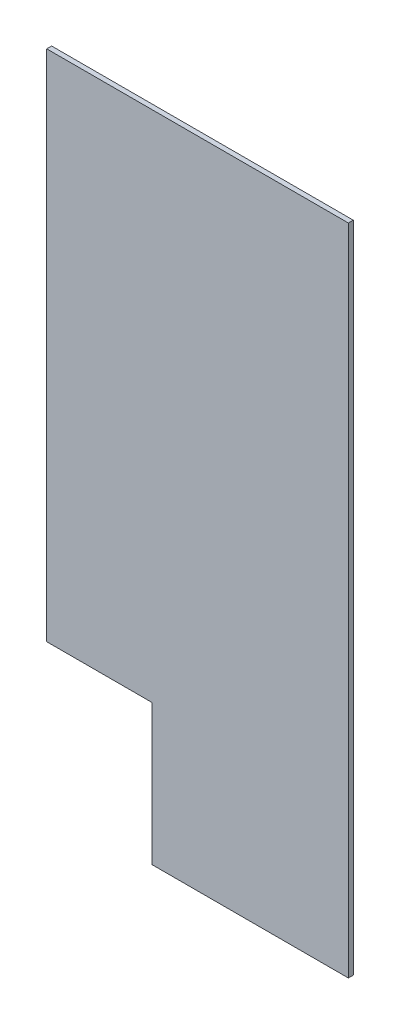
ISO-10303-21;
HEADER;
FILE_DESCRIPTION(('STEP AP214'),'2;1');
FILE_NAME('part.step','',(''),(''),'','','');
FILE_SCHEMA(('AUTOMOTIVE_DESIGN { 1 0 10303 214 1 1 1 1 }'));
ENDSEC;
DATA;
#1=APPLICATION_CONTEXT('core data for automotive mechanical design processes');
#2=APPLICATION_PROTOCOL_DEFINITION('international standard','automotive_design',2000,#1);
#3=PRODUCT_CONTEXT('',#1,'mechanical');
#4=PRODUCT('Part','Part','',(#3));
#5=PRODUCT_RELATED_PRODUCT_CATEGORY('part','',(#4));
#6=PRODUCT_DEFINITION_FORMATION('','',#4);
#7=PRODUCT_DEFINITION_CONTEXT('part definition',#1,'design');
#8=PRODUCT_DEFINITION('design','',#6,#7);
#9=PRODUCT_DEFINITION_SHAPE('','',#8);
#10=(LENGTH_UNIT() NAMED_UNIT(*) SI_UNIT(.MILLI.,.METRE.));
#11=(NAMED_UNIT(*) PLANE_ANGLE_UNIT() SI_UNIT($,.RADIAN.));
#12=(NAMED_UNIT(*) SI_UNIT($,.STERADIAN.) SOLID_ANGLE_UNIT());
#13=UNCERTAINTY_MEASURE_WITH_UNIT(LENGTH_MEASURE(1.E-05),#10,'distance_accuracy_value','');
#14=(GEOMETRIC_REPRESENTATION_CONTEXT(3) GLOBAL_UNCERTAINTY_ASSIGNED_CONTEXT((#13)) GLOBAL_UNIT_ASSIGNED_CONTEXT((#10,
#11,#12)) REPRESENTATION_CONTEXT('',''));
#15=CARTESIAN_POINT('',(0.,0.,0.));
#16=DIRECTION('',(0.,0.,1.));
#17=DIRECTION('',(1.,0.,0.));
#18=AXIS2_PLACEMENT_3D('',#15,#16,#17);
#19=CARTESIAN_POINT('',(0.,0.,4.));
#20=DIRECTION('',(0.,1.,0.));
#21=DIRECTION('',(0.,0.,1.));
#22=AXIS2_PLACEMENT_3D('',#19,#20,#21);
#23=PLANE('',#22);
#24=DIRECTION('',(0.,0.,-1.));
#25=VECTOR('',#24,1.);
#26=CARTESIAN_POINT('',(85.9851705499357,0.,3.99999999999998));
#27=LINE('',#26,#25);
#28=CARTESIAN_POINT('',(85.9851705499357,0.,4.));
#29=VERTEX_POINT('',#28);
#30=CARTESIAN_POINT('',(85.9851705499357,0.,0.));
#31=VERTEX_POINT('',#30);
#32=EDGE_CURVE('E49',#29,#31,#27,.T.);
#33=ORIENTED_EDGE('',*,*,#32,.F.);
#34=DIRECTION('',(1.,0.,0.));
#35=VECTOR('',#34,1.);
#36=CARTESIAN_POINT('',(0.,0.,4.));
#37=LINE('',#36,#35);
#38=CARTESIAN_POINT('',(0.,0.,4.));
#39=VERTEX_POINT('',#38);
#40=EDGE_CURVE('E124',#39,#29,#37,.T.);
#41=ORIENTED_EDGE('',*,*,#40,.F.);
#42=DIRECTION('',(0.,0.,1.));
#43=VECTOR('',#42,1.);
#44=CARTESIAN_POINT('',(0.,0.,0.));
#45=LINE('',#44,#43);
#46=CARTESIAN_POINT('',(0.,0.,0.));
#47=VERTEX_POINT('',#46);
#48=EDGE_CURVE('E90',#47,#39,#45,.T.);
#49=ORIENTED_EDGE('',*,*,#48,.F.);
#50=DIRECTION('',(-1.,0.,0.));
#51=VECTOR('',#50,1.);
#52=CARTESIAN_POINT('',(0.,0.,0.));
#53=LINE('',#52,#51);
#54=EDGE_CURVE('E87',#31,#47,#53,.T.);
#55=ORIENTED_EDGE('',*,*,#54,.F.);
#56=EDGE_LOOP('',(#33,#41,#49,#55));
#57=FACE_BOUND('',#56,.T.);
#58=ADVANCED_FACE('F32',(#57),#23,.F.);
#59=CARTESIAN_POINT('',(0.,664.731364002697,0.));
#60=DIRECTION('',(1.,0.,0.));
#61=DIRECTION('',(0.,0.,-1.));
#62=AXIS2_PLACEMENT_3D('',#59,#60,#61);
#63=PLANE('',#62);
#64=DIRECTION('',(0.,0.,1.));
#65=VECTOR('',#64,1.);
#66=CARTESIAN_POINT('',(0.,418.713673316679,0.));
#67=LINE('',#66,#65);
#68=CARTESIAN_POINT('',(0.,418.713673316679,0.));
#69=VERTEX_POINT('',#68);
#70=CARTESIAN_POINT('',(0.,418.713673316679,4.));
#71=VERTEX_POINT('',#70);
#72=EDGE_CURVE('E172',#69,#71,#67,.T.);
#73=ORIENTED_EDGE('',*,*,#72,.F.);
#74=DIRECTION('',(0.,-1.,0.));
#75=VECTOR('',#74,1.);
#76=CARTESIAN_POINT('',(0.,664.731364002697,0.));
#77=LINE('',#76,#75);
#78=EDGE_CURVE('E57',#69,#47,#77,.T.);
#79=ORIENTED_EDGE('',*,*,#78,.T.);
#80=ORIENTED_EDGE('',*,*,#48,.T.);
#81=DIRECTION('',(0.,-1.,0.));
#82=VECTOR('',#81,1.);
#83=CARTESIAN_POINT('',(0.,664.731364002697,4.));
#84=LINE('',#83,#82);
#85=EDGE_CURVE('E126',#71,#39,#84,.T.);
#86=ORIENTED_EDGE('',*,*,#85,.F.);
#87=EDGE_LOOP('',(#73,#79,#80,#86));
#88=FACE_BOUND('',#87,.T.);
#89=ADVANCED_FACE('F148',(#88),#63,.F.);
#90=CARTESIAN_POINT('',(0.,664.731364002697,4.));
#91=DIRECTION('',(0.,0.,-1.));
#92=DIRECTION('',(-1.,0.,0.));
#93=AXIS2_PLACEMENT_3D('',#90,#91,#92);
#94=PLANE('',#93);
#95=DIRECTION('',(1.,0.,0.));
#96=VECTOR('',#95,1.);
#97=CARTESIAN_POINT('',(0.,418.713673316679,4.));
#98=LINE('',#97,#96);
#99=CARTESIAN_POINT('',(245.985170549936,418.713673316679,4.));
#100=VERTEX_POINT('',#99);
#101=EDGE_CURVE('E41',#71,#100,#98,.T.);
#102=ORIENTED_EDGE('',*,*,#101,.F.);
#103=ORIENTED_EDGE('',*,*,#85,.T.);
#104=ORIENTED_EDGE('',*,*,#40,.T.);
#105=DIRECTION('',(0.,1.,0.));
#106=VECTOR('',#105,1.);
#107=CARTESIAN_POINT('',(85.9851705499357,-274.54999218994,3.99999999999998));
#108=LINE('',#107,#106);
#109=CARTESIAN_POINT('',(85.9851705499357,-114.5,3.99999999999998));
#110=VERTEX_POINT('',#109);
#111=EDGE_CURVE('E102',#110,#29,#108,.T.);
#112=ORIENTED_EDGE('',*,*,#111,.F.);
#113=DIRECTION('',(-1.,0.,0.));
#114=VECTOR('',#113,1.);
#115=CARTESIAN_POINT('',(245.985170549936,-114.5,4.));
#116=LINE('',#115,#114);
#117=CARTESIAN_POINT('',(245.985170549936,-114.5,4.));
#118=VERTEX_POINT('',#117);
#119=EDGE_CURVE('E143',#118,#110,#116,.T.);
#120=ORIENTED_EDGE('',*,*,#119,.F.);
#121=DIRECTION('',(0.,-1.,0.));
#122=VECTOR('',#121,1.);
#123=CARTESIAN_POINT('',(245.985170549936,664.731364002697,4.));
#124=LINE('',#123,#122);
#125=EDGE_CURVE('E125',#100,#118,#124,.T.);
#126=ORIENTED_EDGE('',*,*,#125,.F.);
#127=EDGE_LOOP('',(#102,#103,#104,#112,#120,#126));
#128=FACE_BOUND('',#127,.T.);
#129=ADVANCED_FACE('F145',(#128),#94,.F.);
#130=CARTESIAN_POINT('',(245.985170549936,664.731364002697,0.));
#131=DIRECTION('',(-1.,0.,0.));
#132=DIRECTION('',(0.,0.,1.));
#133=AXIS2_PLACEMENT_3D('',#130,#131,#132);
#134=PLANE('',#133);
#135=DIRECTION('',(0.,0.,-1.));
#136=VECTOR('',#135,1.);
#137=CARTESIAN_POINT('',(245.985170549936,418.713673316679,0.));
#138=LINE('',#137,#136);
#139=CARTESIAN_POINT('',(245.985170549936,418.713673316679,0.));
#140=VERTEX_POINT('',#139);
#141=EDGE_CURVE('E11',#100,#140,#138,.T.);
#142=ORIENTED_EDGE('',*,*,#141,.F.);
#143=ORIENTED_EDGE('',*,*,#125,.T.);
#144=DIRECTION('',(0.,0.,1.));
#145=VECTOR('',#144,1.);
#146=CARTESIAN_POINT('',(245.985170549936,-114.5,4.));
#147=LINE('',#146,#145);
#148=CARTESIAN_POINT('',(245.985170549936,-114.5,0.));
#149=VERTEX_POINT('',#148);
#150=EDGE_CURVE('E114',#149,#118,#147,.T.);
#151=ORIENTED_EDGE('',*,*,#150,.F.);
#152=DIRECTION('',(0.,-1.,0.));
#153=VECTOR('',#152,1.);
#154=CARTESIAN_POINT('',(245.985170549936,664.731364002697,0.));
#155=LINE('',#154,#153);
#156=EDGE_CURVE('E92',#140,#149,#155,.T.);
#157=ORIENTED_EDGE('',*,*,#156,.F.);
#158=EDGE_LOOP('',(#142,#143,#151,#157));
#159=FACE_BOUND('',#158,.T.);
#160=ADVANCED_FACE('F141',(#159),#134,.F.);
#161=CARTESIAN_POINT('',(0.,664.731364002697,0.));
#162=DIRECTION('',(0.,0.,1.));
#163=DIRECTION('',(1.,0.,0.));
#164=AXIS2_PLACEMENT_3D('',#161,#162,#163);
#165=PLANE('',#164);
#166=DIRECTION('',(-1.,0.,0.));
#167=VECTOR('',#166,1.);
#168=CARTESIAN_POINT('',(0.,418.713673316679,0.));
#169=LINE('',#168,#167);
#170=EDGE_CURVE('E91',#140,#69,#169,.T.);
#171=ORIENTED_EDGE('',*,*,#170,.F.);
#172=ORIENTED_EDGE('',*,*,#156,.T.);
#173=DIRECTION('',(1.,0.,0.));
#174=VECTOR('',#173,1.);
#175=CARTESIAN_POINT('',(245.985170549936,-114.5,0.));
#176=LINE('',#175,#174);
#177=CARTESIAN_POINT('',(85.9851705499357,-114.5,0.));
#178=VERTEX_POINT('',#177);
#179=EDGE_CURVE('E99',#178,#149,#176,.T.);
#180=ORIENTED_EDGE('',*,*,#179,.F.);
#181=DIRECTION('',(0.,1.,0.));
#182=VECTOR('',#181,1.);
#183=CARTESIAN_POINT('',(85.9851705499357,-274.54999218994,0.));
#184=LINE('',#183,#182);
#185=EDGE_CURVE('E96',#178,#31,#184,.T.);
#186=ORIENTED_EDGE('',*,*,#185,.T.);
#187=ORIENTED_EDGE('',*,*,#54,.T.);
#188=ORIENTED_EDGE('',*,*,#78,.F.);
#189=EDGE_LOOP('',(#171,#172,#180,#186,#187,#188));
#190=FACE_BOUND('',#189,.T.);
#191=ADVANCED_FACE('F97',(#190),#165,.F.);
#192=CARTESIAN_POINT('',(120.224699525976,418.713673316679,121.415806647967));
#193=DIRECTION('',(0.,1.,0.));
#194=DIRECTION('',(0.,0.,-1.));
#195=AXIS2_PLACEMENT_3D('',#192,#193,#194);
#196=PLANE('',#195);
#197=ORIENTED_EDGE('',*,*,#170,.T.);
#198=ORIENTED_EDGE('',*,*,#72,.T.);
#199=ORIENTED_EDGE('',*,*,#101,.T.);
#200=ORIENTED_EDGE('',*,*,#141,.T.);
#201=EDGE_LOOP('',(#197,#198,#199,#200));
#202=FACE_BOUND('',#201,.T.);
#203=ADVANCED_FACE('F34',(#202),#196,.T.);
#204=CARTESIAN_POINT('',(85.9851705499357,-274.54999218994,3.99999999999998));
#205=DIRECTION('',(1.,0.,0.));
#206=DIRECTION('',(0.,0.,-1.));
#207=AXIS2_PLACEMENT_3D('',#204,#205,#206);
#208=PLANE('',#207);
#209=DIRECTION('',(0.,0.,-1.));
#210=VECTOR('',#209,1.);
#211=CARTESIAN_POINT('',(85.9851705499357,-114.5,3.99999999999998));
#212=LINE('',#211,#210);
#213=EDGE_CURVE('E140',#110,#178,#212,.T.);
#214=ORIENTED_EDGE('',*,*,#213,.F.);
#215=ORIENTED_EDGE('',*,*,#111,.T.);
#216=ORIENTED_EDGE('',*,*,#32,.T.);
#217=ORIENTED_EDGE('',*,*,#185,.F.);
#218=EDGE_LOOP('',(#214,#215,#216,#217));
#219=FACE_BOUND('',#218,.T.);
#220=ADVANCED_FACE('F105',(#219),#208,.F.);
#221=CARTESIAN_POINT('',(-70.5260416352223,-114.5,-69.9397159075643));
#222=DIRECTION('',(0.,-1.,0.));
#223=DIRECTION('',(0.,0.,-1.));
#224=AXIS2_PLACEMENT_3D('',#221,#222,#223);
#225=PLANE('',#224);
#226=ORIENTED_EDGE('',*,*,#150,.T.);
#227=ORIENTED_EDGE('',*,*,#119,.T.);
#228=ORIENTED_EDGE('',*,*,#213,.T.);
#229=ORIENTED_EDGE('',*,*,#179,.T.);
#230=EDGE_LOOP('',(#226,#227,#228,#229));
#231=FACE_BOUND('',#230,.T.);
#232=ADVANCED_FACE('F138',(#231),#225,.T.);
#233=CLOSED_SHELL('',(#58,#89,#129,#160,#191,#203,#220,#232));
#234=MANIFOLD_SOLID_BREP('B2',#233);
#235=ADVANCED_BREP_SHAPE_REPRESENTATION('',(#18,#234),#14);
#236=SHAPE_DEFINITION_REPRESENTATION(#9,#235);
ENDSEC;
END-ISO-10303-21;
